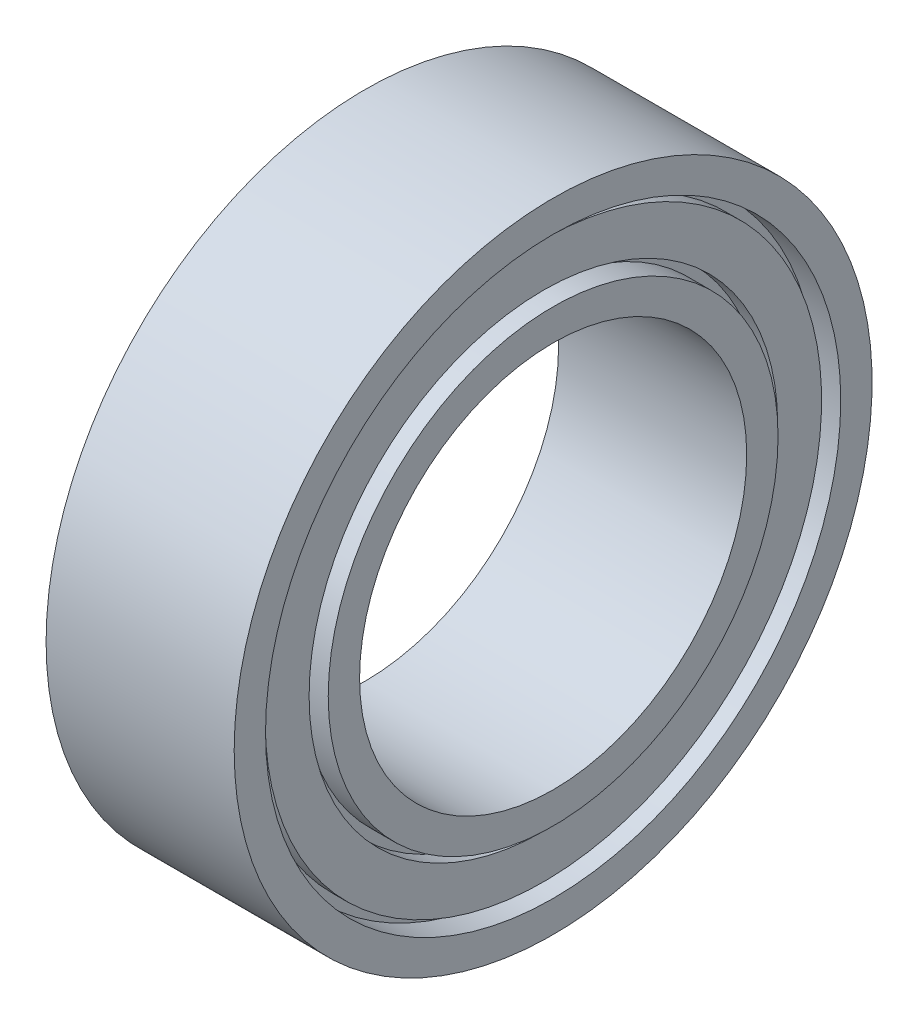
ISO-10303-21;
HEADER;
FILE_DESCRIPTION(('STEP AP214'),'2;1');
FILE_NAME('part.step','',(''),(''),'','','');
FILE_SCHEMA(('AUTOMOTIVE_DESIGN { 1 0 10303 214 1 1 1 1 }'));
ENDSEC;
DATA;
#1=APPLICATION_CONTEXT('core data for automotive mechanical design processes');
#2=APPLICATION_PROTOCOL_DEFINITION('international standard','automotive_design',2000,#1);
#3=PRODUCT_CONTEXT('',#1,'mechanical');
#4=PRODUCT('Part','Part','',(#3));
#5=PRODUCT_RELATED_PRODUCT_CATEGORY('part','',(#4));
#6=PRODUCT_DEFINITION_FORMATION('','',#4);
#7=PRODUCT_DEFINITION_CONTEXT('part definition',#1,'design');
#8=PRODUCT_DEFINITION('design','',#6,#7);
#9=PRODUCT_DEFINITION_SHAPE('','',#8);
#10=(LENGTH_UNIT() NAMED_UNIT(*) SI_UNIT(.MILLI.,.METRE.));
#11=(NAMED_UNIT(*) PLANE_ANGLE_UNIT() SI_UNIT($,.RADIAN.));
#12=(NAMED_UNIT(*) SI_UNIT($,.STERADIAN.) SOLID_ANGLE_UNIT());
#13=UNCERTAINTY_MEASURE_WITH_UNIT(LENGTH_MEASURE(1.E-05),#10,'distance_accuracy_value','');
#14=(GEOMETRIC_REPRESENTATION_CONTEXT(3) GLOBAL_UNCERTAINTY_ASSIGNED_CONTEXT((#13)) GLOBAL_UNIT_ASSIGNED_CONTEXT((#10,
#11,#12)) REPRESENTATION_CONTEXT('',''));
#15=CARTESIAN_POINT('',(0.,0.,0.));
#16=DIRECTION('',(0.,0.,1.));
#17=DIRECTION('',(1.,0.,0.));
#18=AXIS2_PLACEMENT_3D('',#15,#16,#17);
#19=CARTESIAN_POINT('',(1.5,3.08709380804996,0.));
#20=DIRECTION('',(-1.,0.,0.));
#21=DIRECTION('',(0.,0.,1.));
#22=AXIS2_PLACEMENT_3D('',#19,#20,#21);
#23=PLANE('',#22);
#24=CARTESIAN_POINT('',(1.5,0.,0.));
#25=DIRECTION('',(-1.,0.,0.));
#26=DIRECTION('',(0.,0.,1.));
#27=AXIS2_PLACEMENT_3D('',#24,#25,#26);
#28=CIRCLE('',#27,3.58709380804996);
#29=CARTESIAN_POINT('',(1.5,0.,3.58709380804996));
#30=VERTEX_POINT('',#29);
#31=EDGE_CURVE('E10',#30,#30,#28,.T.);
#32=ORIENTED_EDGE('',*,*,#31,.F.);
#33=EDGE_LOOP('',(#32));
#34=FACE_BOUND('',#33,.T.);
#35=CARTESIAN_POINT('',(1.5,0.,0.));
#36=DIRECTION('',(-1.,0.,0.));
#37=DIRECTION('',(0.,0.,1.));
#38=AXIS2_PLACEMENT_3D('',#35,#36,#37);
#39=CIRCLE('',#38,3.08709380804996);
#40=CARTESIAN_POINT('',(1.5,0.,3.08709380804996));
#41=VERTEX_POINT('',#40);
#42=EDGE_CURVE('E107',#41,#41,#39,.T.);
#43=ORIENTED_EDGE('',*,*,#42,.T.);
#44=EDGE_LOOP('',(#43));
#45=FACE_BOUND('',#44,.T.);
#46=ADVANCED_FACE('F43',(#34,#45),#23,.F.);
#47=CARTESIAN_POINT('',(-2.67919431957627,0.,0.));
#48=DIRECTION('',(-1.,0.,0.));
#49=DIRECTION('',(0.,0.,1.));
#50=AXIS2_PLACEMENT_3D('',#47,#48,#49);
#51=CYLINDRICAL_SURFACE('',#50,3.58709380804996);
#52=CARTESIAN_POINT('',(1.1,0.,0.));
#53=DIRECTION('',(-1.,0.,0.));
#54=DIRECTION('',(0.,0.,1.));
#55=AXIS2_PLACEMENT_3D('',#52,#53,#54);
#56=CIRCLE('',#55,3.58709380804996);
#57=CARTESIAN_POINT('',(1.1,0.,3.58709380804996));
#58=VERTEX_POINT('',#57);
#59=EDGE_CURVE('E49',#58,#58,#56,.T.);
#60=ORIENTED_EDGE('',*,*,#59,.F.);
#61=EDGE_LOOP('',(#60));
#62=FACE_BOUND('',#61,.T.);
#63=ORIENTED_EDGE('',*,*,#31,.T.);
#64=EDGE_LOOP('',(#63));
#65=FACE_BOUND('',#64,.T.);
#66=ADVANCED_FACE('F216',(#62,#65),#51,.T.);
#67=CARTESIAN_POINT('',(1.1,3.58709380804996,0.));
#68=DIRECTION('',(-1.,0.,0.));
#69=DIRECTION('',(0.,0.,1.));
#70=AXIS2_PLACEMENT_3D('',#67,#68,#69);
#71=PLANE('',#70);
#72=CARTESIAN_POINT('',(1.1,0.,0.));
#73=DIRECTION('',(-1.,0.,0.));
#74=DIRECTION('',(0.,0.,1.));
#75=AXIS2_PLACEMENT_3D('',#72,#73,#74);
#76=CIRCLE('',#75,3.73709380804996);
#77=CARTESIAN_POINT('',(1.1,0.,3.73709380804996));
#78=VERTEX_POINT('',#77);
#79=EDGE_CURVE('E53',#78,#78,#76,.T.);
#80=ORIENTED_EDGE('',*,*,#79,.F.);
#81=EDGE_LOOP('',(#80));
#82=FACE_BOUND('',#81,.T.);
#83=ORIENTED_EDGE('',*,*,#59,.T.);
#84=EDGE_LOOP('',(#83));
#85=FACE_BOUND('',#84,.T.);
#86=ADVANCED_FACE('F211',(#82,#85),#71,.F.);
#87=CARTESIAN_POINT('',(-2.67919431957627,0.,0.));
#88=DIRECTION('',(-1.,0.,0.));
#89=DIRECTION('',(0.,0.,1.));
#90=AXIS2_PLACEMENT_3D('',#87,#88,#89);
#91=CYLINDRICAL_SURFACE('',#90,3.73709380804996);
#92=CARTESIAN_POINT('',(1.34479677877589,0.,0.));
#93=DIRECTION('',(-1.,0.,0.));
#94=DIRECTION('',(0.,0.,1.));
#95=AXIS2_PLACEMENT_3D('',#92,#93,#94);
#96=CIRCLE('',#95,3.73709380804996);
#97=CARTESIAN_POINT('',(1.34479677877589,0.,3.73709380804996));
#98=VERTEX_POINT('',#97);
#99=EDGE_CURVE('E57',#98,#98,#96,.T.);
#100=ORIENTED_EDGE('',*,*,#99,.F.);
#101=EDGE_LOOP('',(#100));
#102=FACE_BOUND('',#101,.T.);
#103=ORIENTED_EDGE('',*,*,#79,.T.);
#104=EDGE_LOOP('',(#103));
#105=FACE_BOUND('',#104,.T.);
#106=ADVANCED_FACE('F205',(#102,#105),#91,.F.);
#107=CARTESIAN_POINT('',(1.34479677877589,3.73709380804996,0.));
#108=DIRECTION('',(-1.,0.,0.));
#109=DIRECTION('',(0.,0.,1.));
#110=AXIS2_PLACEMENT_3D('',#107,#108,#109);
#111=PLANE('',#110);
#112=CARTESIAN_POINT('',(1.34479677877589,0.,0.));
#113=DIRECTION('',(-1.,0.,0.));
#114=DIRECTION('',(0.,0.,1.));
#115=AXIS2_PLACEMENT_3D('',#112,#113,#114);
#116=CIRCLE('',#115,4.43709380804996);
#117=CARTESIAN_POINT('',(1.34479677877589,0.,4.43709380804996));
#118=VERTEX_POINT('',#117);
#119=EDGE_CURVE('E62',#118,#118,#116,.T.);
#120=ORIENTED_EDGE('',*,*,#119,.F.);
#121=EDGE_LOOP('',(#120));
#122=FACE_BOUND('',#121,.T.);
#123=ORIENTED_EDGE('',*,*,#99,.T.);
#124=EDGE_LOOP('',(#123));
#125=FACE_BOUND('',#124,.T.);
#126=ADVANCED_FACE('F199',(#122,#125),#111,.F.);
#127=CARTESIAN_POINT('',(-2.67919431957627,0.,0.));
#128=DIRECTION('',(-1.,0.,0.));
#129=DIRECTION('',(0.,0.,1.));
#130=AXIS2_PLACEMENT_3D('',#127,#128,#129);
#131=CYLINDRICAL_SURFACE('',#130,4.43709380804996);
#132=CARTESIAN_POINT('',(1.1,0.,0.));
#133=DIRECTION('',(-1.,0.,0.));
#134=DIRECTION('',(0.,0.,1.));
#135=AXIS2_PLACEMENT_3D('',#132,#133,#134);
#136=CIRCLE('',#135,4.43709380804996);
#137=CARTESIAN_POINT('',(1.1,0.,4.43709380804996));
#138=VERTEX_POINT('',#137);
#139=EDGE_CURVE('E65',#138,#138,#136,.T.);
#140=ORIENTED_EDGE('',*,*,#139,.F.);
#141=EDGE_LOOP('',(#140));
#142=FACE_BOUND('',#141,.T.);
#143=ORIENTED_EDGE('',*,*,#119,.T.);
#144=EDGE_LOOP('',(#143));
#145=FACE_BOUND('',#144,.T.);
#146=ADVANCED_FACE('F193',(#142,#145),#131,.T.);
#147=CARTESIAN_POINT('',(1.1,4.43709380804996,0.));
#148=DIRECTION('',(-1.,0.,0.));
#149=DIRECTION('',(0.,0.,1.));
#150=AXIS2_PLACEMENT_3D('',#147,#148,#149);
#151=PLANE('',#150);
#152=CARTESIAN_POINT('',(1.1,0.,0.));
#153=DIRECTION('',(-1.,0.,0.));
#154=DIRECTION('',(0.,0.,1.));
#155=AXIS2_PLACEMENT_3D('',#152,#153,#154);
#156=CIRCLE('',#155,4.58709380804996);
#157=CARTESIAN_POINT('',(1.1,0.,4.58709380804996));
#158=VERTEX_POINT('',#157);
#159=EDGE_CURVE('E68',#158,#158,#156,.T.);
#160=ORIENTED_EDGE('',*,*,#159,.F.);
#161=EDGE_LOOP('',(#160));
#162=FACE_BOUND('',#161,.T.);
#163=ORIENTED_EDGE('',*,*,#139,.T.);
#164=EDGE_LOOP('',(#163));
#165=FACE_BOUND('',#164,.T.);
#166=ADVANCED_FACE('F187',(#162,#165),#151,.F.);
#167=CARTESIAN_POINT('',(-2.67919431957627,0.,0.));
#168=DIRECTION('',(-1.,0.,0.));
#169=DIRECTION('',(0.,0.,1.));
#170=AXIS2_PLACEMENT_3D('',#167,#168,#169);
#171=CYLINDRICAL_SURFACE('',#170,4.58709380804996);
#172=CARTESIAN_POINT('',(1.5,0.,0.));
#173=DIRECTION('',(-1.,0.,0.));
#174=DIRECTION('',(0.,0.,1.));
#175=AXIS2_PLACEMENT_3D('',#172,#173,#174);
#176=CIRCLE('',#175,4.58709380804996);
#177=CARTESIAN_POINT('',(1.5,0.,4.58709380804996));
#178=VERTEX_POINT('',#177);
#179=EDGE_CURVE('E71',#178,#178,#176,.T.);
#180=ORIENTED_EDGE('',*,*,#179,.F.);
#181=EDGE_LOOP('',(#180));
#182=FACE_BOUND('',#181,.T.);
#183=ORIENTED_EDGE('',*,*,#159,.T.);
#184=EDGE_LOOP('',(#183));
#185=FACE_BOUND('',#184,.T.);
#186=ADVANCED_FACE('F181',(#182,#185),#171,.F.);
#187=CARTESIAN_POINT('',(1.5,4.58709380804996,0.));
#188=DIRECTION('',(-1.,0.,0.));
#189=DIRECTION('',(0.,0.,1.));
#190=AXIS2_PLACEMENT_3D('',#187,#188,#189);
#191=PLANE('',#190);
#192=CARTESIAN_POINT('',(1.5,0.,0.));
#193=DIRECTION('',(-1.,0.,0.));
#194=DIRECTION('',(0.,0.,1.));
#195=AXIS2_PLACEMENT_3D('',#192,#193,#194);
#196=CIRCLE('',#195,5.08709380804996);
#197=CARTESIAN_POINT('',(1.5,0.,5.08709380804996));
#198=VERTEX_POINT('',#197);
#199=EDGE_CURVE('E74',#198,#198,#196,.T.);
#200=ORIENTED_EDGE('',*,*,#199,.F.);
#201=EDGE_LOOP('',(#200));
#202=FACE_BOUND('',#201,.T.);
#203=ORIENTED_EDGE('',*,*,#179,.T.);
#204=EDGE_LOOP('',(#203));
#205=FACE_BOUND('',#204,.T.);
#206=ADVANCED_FACE('F175',(#202,#205),#191,.F.);
#207=CARTESIAN_POINT('',(-2.67919431957627,0.,0.));
#208=DIRECTION('',(-1.,0.,0.));
#209=DIRECTION('',(0.,0.,1.));
#210=AXIS2_PLACEMENT_3D('',#207,#208,#209);
#211=CYLINDRICAL_SURFACE('',#210,5.08709380804996);
#212=CARTESIAN_POINT('',(-1.5,0.,0.));
#213=DIRECTION('',(-1.,0.,0.));
#214=DIRECTION('',(0.,0.,1.));
#215=AXIS2_PLACEMENT_3D('',#212,#213,#214);
#216=CIRCLE('',#215,5.08709380804996);
#217=CARTESIAN_POINT('',(-1.5,0.,5.08709380804996));
#218=VERTEX_POINT('',#217);
#219=EDGE_CURVE('E77',#218,#218,#216,.T.);
#220=ORIENTED_EDGE('',*,*,#219,.F.);
#221=EDGE_LOOP('',(#220));
#222=FACE_BOUND('',#221,.T.);
#223=ORIENTED_EDGE('',*,*,#199,.T.);
#224=EDGE_LOOP('',(#223));
#225=FACE_BOUND('',#224,.T.);
#226=ADVANCED_FACE('F169',(#222,#225),#211,.T.);
#227=CARTESIAN_POINT('',(-1.5,4.58709380804996,0.));
#228=DIRECTION('',(1.,0.,0.));
#229=DIRECTION('',(0.,0.,-1.));
#230=AXIS2_PLACEMENT_3D('',#227,#228,#229);
#231=PLANE('',#230);
#232=CARTESIAN_POINT('',(-1.5,0.,0.));
#233=DIRECTION('',(-1.,0.,0.));
#234=DIRECTION('',(0.,0.,1.));
#235=AXIS2_PLACEMENT_3D('',#232,#233,#234);
#236=CIRCLE('',#235,4.58709380804996);
#237=CARTESIAN_POINT('',(-1.5,0.,4.58709380804996));
#238=VERTEX_POINT('',#237);
#239=EDGE_CURVE('E80',#238,#238,#236,.T.);
#240=ORIENTED_EDGE('',*,*,#239,.F.);
#241=EDGE_LOOP('',(#240));
#242=FACE_BOUND('',#241,.T.);
#243=ORIENTED_EDGE('',*,*,#219,.T.);
#244=EDGE_LOOP('',(#243));
#245=FACE_BOUND('',#244,.T.);
#246=ADVANCED_FACE('F163',(#242,#245),#231,.F.);
#247=CARTESIAN_POINT('',(-2.67919431957627,0.,0.));
#248=DIRECTION('',(-1.,0.,0.));
#249=DIRECTION('',(0.,0.,1.));
#250=AXIS2_PLACEMENT_3D('',#247,#248,#249);
#251=CYLINDRICAL_SURFACE('',#250,4.58709380804996);
#252=CARTESIAN_POINT('',(-1.1,0.,0.));
#253=DIRECTION('',(-1.,0.,0.));
#254=DIRECTION('',(0.,0.,1.));
#255=AXIS2_PLACEMENT_3D('',#252,#253,#254);
#256=CIRCLE('',#255,4.58709380804996);
#257=CARTESIAN_POINT('',(-1.1,0.,4.58709380804996));
#258=VERTEX_POINT('',#257);
#259=EDGE_CURVE('E83',#258,#258,#256,.T.);
#260=ORIENTED_EDGE('',*,*,#259,.F.);
#261=EDGE_LOOP('',(#260));
#262=FACE_BOUND('',#261,.T.);
#263=ORIENTED_EDGE('',*,*,#239,.T.);
#264=EDGE_LOOP('',(#263));
#265=FACE_BOUND('',#264,.T.);
#266=ADVANCED_FACE('F157',(#262,#265),#251,.F.);
#267=CARTESIAN_POINT('',(-1.1,4.43709380804996,0.));
#268=DIRECTION('',(1.,0.,0.));
#269=DIRECTION('',(0.,0.,-1.));
#270=AXIS2_PLACEMENT_3D('',#267,#268,#269);
#271=PLANE('',#270);
#272=CARTESIAN_POINT('',(-1.1,0.,0.));
#273=DIRECTION('',(-1.,0.,0.));
#274=DIRECTION('',(0.,0.,1.));
#275=AXIS2_PLACEMENT_3D('',#272,#273,#274);
#276=CIRCLE('',#275,4.43709380804996);
#277=CARTESIAN_POINT('',(-1.1,0.,4.43709380804996));
#278=VERTEX_POINT('',#277);
#279=EDGE_CURVE('E86',#278,#278,#276,.T.);
#280=ORIENTED_EDGE('',*,*,#279,.F.);
#281=EDGE_LOOP('',(#280));
#282=FACE_BOUND('',#281,.T.);
#283=ORIENTED_EDGE('',*,*,#259,.T.);
#284=EDGE_LOOP('',(#283));
#285=FACE_BOUND('',#284,.T.);
#286=ADVANCED_FACE('F151',(#282,#285),#271,.F.);
#287=CARTESIAN_POINT('',(-2.67919431957627,0.,0.));
#288=DIRECTION('',(-1.,0.,0.));
#289=DIRECTION('',(0.,0.,1.));
#290=AXIS2_PLACEMENT_3D('',#287,#288,#289);
#291=CYLINDRICAL_SURFACE('',#290,4.43709380804996);
#292=CARTESIAN_POINT('',(-1.34479677877589,0.,0.));
#293=DIRECTION('',(-1.,0.,0.));
#294=DIRECTION('',(0.,0.,1.));
#295=AXIS2_PLACEMENT_3D('',#292,#293,#294);
#296=CIRCLE('',#295,4.43709380804996);
#297=CARTESIAN_POINT('',(-1.34479677877589,0.,4.43709380804996));
#298=VERTEX_POINT('',#297);
#299=EDGE_CURVE('E89',#298,#298,#296,.T.);
#300=ORIENTED_EDGE('',*,*,#299,.F.);
#301=EDGE_LOOP('',(#300));
#302=FACE_BOUND('',#301,.T.);
#303=ORIENTED_EDGE('',*,*,#279,.T.);
#304=EDGE_LOOP('',(#303));
#305=FACE_BOUND('',#304,.T.);
#306=ADVANCED_FACE('F145',(#302,#305),#291,.T.);
#307=CARTESIAN_POINT('',(-1.34479677877589,3.73709380804996,0.));
#308=DIRECTION('',(1.,0.,0.));
#309=DIRECTION('',(0.,0.,-1.));
#310=AXIS2_PLACEMENT_3D('',#307,#308,#309);
#311=PLANE('',#310);
#312=CARTESIAN_POINT('',(-1.34479677877589,0.,0.));
#313=DIRECTION('',(-1.,0.,0.));
#314=DIRECTION('',(0.,0.,1.));
#315=AXIS2_PLACEMENT_3D('',#312,#313,#314);
#316=CIRCLE('',#315,3.73709380804996);
#317=CARTESIAN_POINT('',(-1.34479677877589,0.,3.73709380804996));
#318=VERTEX_POINT('',#317);
#319=EDGE_CURVE('E92',#318,#318,#316,.T.);
#320=ORIENTED_EDGE('',*,*,#319,.F.);
#321=EDGE_LOOP('',(#320));
#322=FACE_BOUND('',#321,.T.);
#323=ORIENTED_EDGE('',*,*,#299,.T.);
#324=EDGE_LOOP('',(#323));
#325=FACE_BOUND('',#324,.T.);
#326=ADVANCED_FACE('F139',(#322,#325),#311,.F.);
#327=CARTESIAN_POINT('',(-2.67919431957627,0.,0.));
#328=DIRECTION('',(-1.,0.,0.));
#329=DIRECTION('',(0.,0.,1.));
#330=AXIS2_PLACEMENT_3D('',#327,#328,#329);
#331=CYLINDRICAL_SURFACE('',#330,3.73709380804996);
#332=CARTESIAN_POINT('',(-1.1,0.,0.));
#333=DIRECTION('',(-1.,0.,0.));
#334=DIRECTION('',(0.,0.,1.));
#335=AXIS2_PLACEMENT_3D('',#332,#333,#334);
#336=CIRCLE('',#335,3.73709380804996);
#337=CARTESIAN_POINT('',(-1.1,0.,3.73709380804996));
#338=VERTEX_POINT('',#337);
#339=EDGE_CURVE('E95',#338,#338,#336,.T.);
#340=ORIENTED_EDGE('',*,*,#339,.F.);
#341=EDGE_LOOP('',(#340));
#342=FACE_BOUND('',#341,.T.);
#343=ORIENTED_EDGE('',*,*,#319,.T.);
#344=EDGE_LOOP('',(#343));
#345=FACE_BOUND('',#344,.T.);
#346=ADVANCED_FACE('F133',(#342,#345),#331,.F.);
#347=CARTESIAN_POINT('',(-1.1,3.58709380804996,0.));
#348=DIRECTION('',(1.,0.,0.));
#349=DIRECTION('',(0.,0.,-1.));
#350=AXIS2_PLACEMENT_3D('',#347,#348,#349);
#351=PLANE('',#350);
#352=CARTESIAN_POINT('',(-1.1,0.,0.));
#353=DIRECTION('',(-1.,0.,0.));
#354=DIRECTION('',(0.,0.,1.));
#355=AXIS2_PLACEMENT_3D('',#352,#353,#354);
#356=CIRCLE('',#355,3.58709380804996);
#357=CARTESIAN_POINT('',(-1.1,0.,3.58709380804996));
#358=VERTEX_POINT('',#357);
#359=EDGE_CURVE('E98',#358,#358,#356,.T.);
#360=ORIENTED_EDGE('',*,*,#359,.F.);
#361=EDGE_LOOP('',(#360));
#362=FACE_BOUND('',#361,.T.);
#363=ORIENTED_EDGE('',*,*,#339,.T.);
#364=EDGE_LOOP('',(#363));
#365=FACE_BOUND('',#364,.T.);
#366=ADVANCED_FACE('F127',(#362,#365),#351,.F.);
#367=CARTESIAN_POINT('',(-2.67919431957627,0.,0.));
#368=DIRECTION('',(-1.,0.,0.));
#369=DIRECTION('',(0.,0.,1.));
#370=AXIS2_PLACEMENT_3D('',#367,#368,#369);
#371=CYLINDRICAL_SURFACE('',#370,3.58709380804996);
#372=CARTESIAN_POINT('',(-1.5,0.,0.));
#373=DIRECTION('',(-1.,0.,0.));
#374=DIRECTION('',(0.,0.,1.));
#375=AXIS2_PLACEMENT_3D('',#372,#373,#374);
#376=CIRCLE('',#375,3.58709380804996);
#377=CARTESIAN_POINT('',(-1.5,0.,3.58709380804996));
#378=VERTEX_POINT('',#377);
#379=EDGE_CURVE('E101',#378,#378,#376,.T.);
#380=ORIENTED_EDGE('',*,*,#379,.F.);
#381=EDGE_LOOP('',(#380));
#382=FACE_BOUND('',#381,.T.);
#383=ORIENTED_EDGE('',*,*,#359,.T.);
#384=EDGE_LOOP('',(#383));
#385=FACE_BOUND('',#384,.T.);
#386=ADVANCED_FACE('F121',(#382,#385),#371,.T.);
#387=CARTESIAN_POINT('',(-1.5,3.08709380804996,0.));
#388=DIRECTION('',(1.,0.,0.));
#389=DIRECTION('',(0.,0.,-1.));
#390=AXIS2_PLACEMENT_3D('',#387,#388,#389);
#391=PLANE('',#390);
#392=CARTESIAN_POINT('',(-1.5,0.,0.));
#393=DIRECTION('',(-1.,0.,0.));
#394=DIRECTION('',(0.,0.,1.));
#395=AXIS2_PLACEMENT_3D('',#392,#393,#394);
#396=CIRCLE('',#395,3.08709380804996);
#397=CARTESIAN_POINT('',(-1.5,0.,3.08709380804996));
#398=VERTEX_POINT('',#397);
#399=EDGE_CURVE('E104',#398,#398,#396,.T.);
#400=ORIENTED_EDGE('',*,*,#399,.F.);
#401=EDGE_LOOP('',(#400));
#402=FACE_BOUND('',#401,.T.);
#403=ORIENTED_EDGE('',*,*,#379,.T.);
#404=EDGE_LOOP('',(#403));
#405=FACE_BOUND('',#404,.T.);
#406=ADVANCED_FACE('F115',(#402,#405),#391,.F.);
#407=CARTESIAN_POINT('',(-2.67919431957627,0.,0.));
#408=DIRECTION('',(-1.,0.,0.));
#409=DIRECTION('',(0.,0.,1.));
#410=AXIS2_PLACEMENT_3D('',#407,#408,#409);
#411=CYLINDRICAL_SURFACE('',#410,3.08709380804996);
#412=ORIENTED_EDGE('',*,*,#42,.F.);
#413=EDGE_LOOP('',(#412));
#414=FACE_BOUND('',#413,.T.);
#415=ORIENTED_EDGE('',*,*,#399,.T.);
#416=EDGE_LOOP('',(#415));
#417=FACE_BOUND('',#416,.T.);
#418=ADVANCED_FACE('F112',(#414,#417),#411,.F.);
#419=CLOSED_SHELL('',(#46,#66,#86,#106,#126,#146,#166,#186,#206,#226,#246,#266,#286,#306,#326,
#346,#366,#386,#406,#418));
#420=MANIFOLD_SOLID_BREP('B2',#419);
#421=ADVANCED_BREP_SHAPE_REPRESENTATION('',(#18,#420),#14);
#422=SHAPE_DEFINITION_REPRESENTATION(#9,#421);
ENDSEC;
END-ISO-10303-21;
